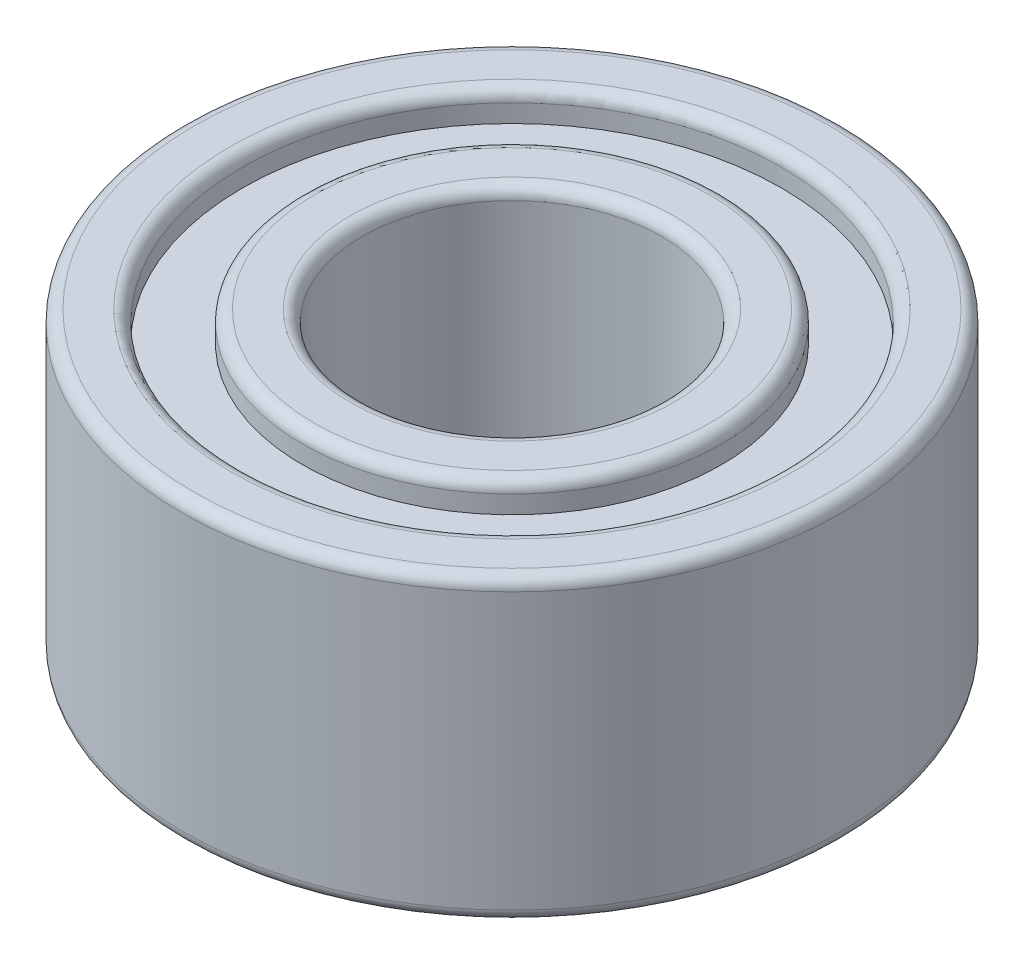
ISO-10303-21;
HEADER;
FILE_DESCRIPTION(('STEP AP214'),'2;1');
FILE_NAME('part.step','',(''),(''),'','','');
FILE_SCHEMA(('AUTOMOTIVE_DESIGN { 1 0 10303 214 1 1 1 1 }'));
ENDSEC;
DATA;
#1=APPLICATION_CONTEXT('core data for automotive mechanical design processes');
#2=APPLICATION_PROTOCOL_DEFINITION('international standard','automotive_design',2000,#1);
#3=PRODUCT_CONTEXT('',#1,'mechanical');
#4=PRODUCT('Part','Part','',(#3));
#5=PRODUCT_RELATED_PRODUCT_CATEGORY('part','',(#4));
#6=PRODUCT_DEFINITION_FORMATION('','',#4);
#7=PRODUCT_DEFINITION_CONTEXT('part definition',#1,'design');
#8=PRODUCT_DEFINITION('design','',#6,#7);
#9=PRODUCT_DEFINITION_SHAPE('','',#8);
#10=(LENGTH_UNIT() NAMED_UNIT(*) SI_UNIT(.MILLI.,.METRE.));
#11=(NAMED_UNIT(*) PLANE_ANGLE_UNIT() SI_UNIT($,.RADIAN.));
#12=(NAMED_UNIT(*) SI_UNIT($,.STERADIAN.) SOLID_ANGLE_UNIT());
#13=UNCERTAINTY_MEASURE_WITH_UNIT(LENGTH_MEASURE(1.E-05),#10,'distance_accuracy_value','');
#14=(GEOMETRIC_REPRESENTATION_CONTEXT(3) GLOBAL_UNCERTAINTY_ASSIGNED_CONTEXT((#13)) GLOBAL_UNIT_ASSIGNED_CONTEXT((#10,
#11,#12)) REPRESENTATION_CONTEXT('',''));
#15=CARTESIAN_POINT('',(0.,0.,0.));
#16=DIRECTION('',(0.,0.,1.));
#17=DIRECTION('',(1.,0.,0.));
#18=AXIS2_PLACEMENT_3D('',#15,#16,#17);
#19=CARTESIAN_POINT('',(0.,0.,0.));
#20=DIRECTION('',(0.,-1.,0.));
#21=DIRECTION('',(0.,0.,-1.));
#22=AXIS2_PLACEMENT_3D('',#19,#20,#21);
#23=CYLINDRICAL_SURFACE('',#22,2.5);
#24=CARTESIAN_POINT('',(0.,2.3,0.));
#25=DIRECTION('',(0.,1.,0.));
#26=DIRECTION('',(0.,0.,1.));
#27=AXIS2_PLACEMENT_3D('',#24,#25,#26);
#28=CIRCLE('',#27,2.5);
#29=CARTESIAN_POINT('',(0.,2.3,2.5));
#30=VERTEX_POINT('',#29);
#31=EDGE_CURVE('E266',#30,#30,#28,.F.);
#32=ORIENTED_EDGE('',*,*,#31,.F.);
#33=EDGE_LOOP('',(#32));
#34=FACE_BOUND('',#33,.T.);
#35=CARTESIAN_POINT('',(0.,-2.3,0.));
#36=DIRECTION('',(0.,-1.,0.));
#37=DIRECTION('',(0.,0.,-1.));
#38=AXIS2_PLACEMENT_3D('',#35,#36,#37);
#39=CIRCLE('',#38,2.5);
#40=CARTESIAN_POINT('',(0.,-2.3,-2.5));
#41=VERTEX_POINT('',#40);
#42=EDGE_CURVE('E92',#41,#41,#39,.F.);
#43=ORIENTED_EDGE('',*,*,#42,.F.);
#44=EDGE_LOOP('',(#43));
#45=FACE_BOUND('',#44,.T.);
#46=ADVANCED_FACE('F17',(#34,#45),#23,.F.);
#47=CARTESIAN_POINT('',(0.,2.3,0.));
#48=DIRECTION('',(0.,1.,0.));
#49=DIRECTION('',(0.,0.,1.));
#50=AXIS2_PLACEMENT_3D('',#47,#48,#49);
#51=TOROIDAL_SURFACE('',#50,2.7,0.2);
#52=ORIENTED_EDGE('',*,*,#31,.T.);
#53=EDGE_LOOP('',(#52));
#54=FACE_BOUND('',#53,.T.);
#55=CARTESIAN_POINT('',(0.,2.5,0.));
#56=DIRECTION('',(0.,1.,0.));
#57=DIRECTION('',(0.,0.,1.));
#58=AXIS2_PLACEMENT_3D('',#55,#56,#57);
#59=CIRCLE('',#58,2.7);
#60=CARTESIAN_POINT('',(0.,2.5,-2.7));
#61=VERTEX_POINT('',#60);
#62=CARTESIAN_POINT('',(0.,2.5,2.7));
#63=VERTEX_POINT('',#62);
#64=EDGE_CURVE('E82',#61,#63,#59,.F.);
#65=ORIENTED_EDGE('',*,*,#64,.F.);
#66=CARTESIAN_POINT('',(0.,2.5,0.));
#67=DIRECTION('',(0.,1.,0.));
#68=DIRECTION('',(0.,0.,-1.));
#69=AXIS2_PLACEMENT_3D('',#66,#67,#68);
#70=CIRCLE('',#69,2.7);
#71=EDGE_CURVE('E80',#63,#61,#70,.F.);
#72=ORIENTED_EDGE('',*,*,#71,.F.);
#73=EDGE_LOOP('',(#65,#72));
#74=FACE_BOUND('',#73,.T.);
#75=ADVANCED_FACE('F84',(#54,#74),#51,.T.);
#76=CARTESIAN_POINT('',(0.,-2.3,0.));
#77=DIRECTION('',(0.,-1.,0.));
#78=DIRECTION('',(0.,0.,-1.));
#79=AXIS2_PLACEMENT_3D('',#76,#77,#78);
#80=TOROIDAL_SURFACE('',#79,2.7,0.2);
#81=ORIENTED_EDGE('',*,*,#42,.T.);
#82=EDGE_LOOP('',(#81));
#83=FACE_BOUND('',#82,.T.);
#84=CARTESIAN_POINT('',(0.,-2.5,0.));
#85=DIRECTION('',(0.,-1.,0.));
#86=DIRECTION('',(0.,0.,-1.));
#87=AXIS2_PLACEMENT_3D('',#84,#85,#86);
#88=CIRCLE('',#87,2.7);
#89=CARTESIAN_POINT('',(0.,-2.5,2.7));
#90=VERTEX_POINT('',#89);
#91=CARTESIAN_POINT('',(0.,-2.5,-2.7));
#92=VERTEX_POINT('',#91);
#93=EDGE_CURVE('E185',#90,#92,#88,.F.);
#94=ORIENTED_EDGE('',*,*,#93,.F.);
#95=CARTESIAN_POINT('',(0.,-2.5,0.));
#96=DIRECTION('',(0.,-1.,0.));
#97=DIRECTION('',(0.,0.,1.));
#98=AXIS2_PLACEMENT_3D('',#95,#96,#97);
#99=CIRCLE('',#98,2.7);
#100=EDGE_CURVE('E87',#92,#90,#99,.F.);
#101=ORIENTED_EDGE('',*,*,#100,.F.);
#102=EDGE_LOOP('',(#94,#101));
#103=FACE_BOUND('',#102,.T.);
#104=ADVANCED_FACE('F113',(#83,#103),#80,.T.);
#105=CARTESIAN_POINT('',(3.5,2.5,0.));
#106=DIRECTION('',(0.,1.,0.));
#107=DIRECTION('',(0.,0.,1.));
#108=AXIS2_PLACEMENT_3D('',#105,#106,#107);
#109=PLANE('',#108);
#110=CARTESIAN_POINT('',(0.,2.5,0.));
#111=DIRECTION('',(0.,-1.,0.));
#112=DIRECTION('',(0.,0.,-1.));
#113=AXIS2_PLACEMENT_3D('',#110,#111,#112);
#114=CIRCLE('',#113,3.3);
#115=CARTESIAN_POINT('',(0.,2.5,-3.3));
#116=VERTEX_POINT('',#115);
#117=CARTESIAN_POINT('',(0.,2.5,3.3));
#118=VERTEX_POINT('',#117);
#119=EDGE_CURVE('E220',#116,#118,#114,.T.);
#120=ORIENTED_EDGE('',*,*,#119,.F.);
#121=CARTESIAN_POINT('',(0.,2.5,0.));
#122=DIRECTION('',(0.,-1.,0.));
#123=DIRECTION('',(0.,0.,1.));
#124=AXIS2_PLACEMENT_3D('',#121,#122,#123);
#125=CIRCLE('',#124,3.3);
#126=EDGE_CURVE('E137',#118,#116,#125,.T.);
#127=ORIENTED_EDGE('',*,*,#126,.F.);
#128=EDGE_LOOP('',(#120,#127));
#129=FACE_BOUND('',#128,.T.);
#130=ORIENTED_EDGE('',*,*,#71,.T.);
#131=ORIENTED_EDGE('',*,*,#64,.T.);
#132=EDGE_LOOP('',(#130,#131));
#133=FACE_BOUND('',#132,.T.);
#134=ADVANCED_FACE('F91',(#129,#133),#109,.T.);
#135=CARTESIAN_POINT('',(2.5,-2.5,0.));
#136=DIRECTION('',(0.,-1.,0.));
#137=DIRECTION('',(0.,0.,-1.));
#138=AXIS2_PLACEMENT_3D('',#135,#136,#137);
#139=PLANE('',#138);
#140=CARTESIAN_POINT('',(0.,-2.5,0.));
#141=DIRECTION('',(0.,1.,0.));
#142=DIRECTION('',(0.,0.,1.));
#143=AXIS2_PLACEMENT_3D('',#140,#141,#142);
#144=CIRCLE('',#143,3.3);
#145=CARTESIAN_POINT('',(0.,-2.5,3.3));
#146=VERTEX_POINT('',#145);
#147=CARTESIAN_POINT('',(0.,-2.5,-3.3));
#148=VERTEX_POINT('',#147);
#149=EDGE_CURVE('E197',#146,#148,#144,.T.);
#150=ORIENTED_EDGE('',*,*,#149,.F.);
#151=CARTESIAN_POINT('',(0.,-2.5,0.));
#152=DIRECTION('',(0.,1.,0.));
#153=DIRECTION('',(0.,0.,-1.));
#154=AXIS2_PLACEMENT_3D('',#151,#152,#153);
#155=CIRCLE('',#154,3.3);
#156=EDGE_CURVE('E208',#148,#146,#155,.T.);
#157=ORIENTED_EDGE('',*,*,#156,.F.);
#158=EDGE_LOOP('',(#150,#157));
#159=FACE_BOUND('',#158,.T.);
#160=ORIENTED_EDGE('',*,*,#100,.T.);
#161=ORIENTED_EDGE('',*,*,#93,.T.);
#162=EDGE_LOOP('',(#160,#161));
#163=FACE_BOUND('',#162,.T.);
#164=ADVANCED_FACE('F112',(#159,#163),#139,.T.);
#165=CARTESIAN_POINT('',(0.,2.3,0.));
#166=DIRECTION('',(0.,1.,0.));
#167=DIRECTION('',(0.,0.,1.));
#168=AXIS2_PLACEMENT_3D('',#165,#166,#167);
#169=TOROIDAL_SURFACE('',#168,3.3,0.2);
#170=CARTESIAN_POINT('',(0.,2.3,0.));
#171=DIRECTION('',(0.,-1.,0.));
#172=DIRECTION('',(0.,0.,-1.));
#173=AXIS2_PLACEMENT_3D('',#170,#171,#172);
#174=CIRCLE('',#173,3.5);
#175=CARTESIAN_POINT('',(0.,2.3,-3.5));
#176=VERTEX_POINT('',#175);
#177=EDGE_CURVE('E170',#176,#176,#174,.T.);
#178=ORIENTED_EDGE('',*,*,#177,.F.);
#179=EDGE_LOOP('',(#178));
#180=FACE_BOUND('',#179,.T.);
#181=ORIENTED_EDGE('',*,*,#126,.T.);
#182=ORIENTED_EDGE('',*,*,#119,.T.);
#183=EDGE_LOOP('',(#181,#182));
#184=FACE_BOUND('',#183,.T.);
#185=ADVANCED_FACE('F152',(#180,#184),#169,.T.);
#186=CARTESIAN_POINT('',(0.,-2.3,0.));
#187=DIRECTION('',(0.,-1.,0.));
#188=DIRECTION('',(0.,0.,-1.));
#189=AXIS2_PLACEMENT_3D('',#186,#187,#188);
#190=TOROIDAL_SURFACE('',#189,3.3,0.2);
#191=CARTESIAN_POINT('',(0.,-2.3,0.));
#192=DIRECTION('',(0.,-1.,0.));
#193=DIRECTION('',(0.,0.,-1.));
#194=AXIS2_PLACEMENT_3D('',#191,#192,#193);
#195=CIRCLE('',#194,3.5);
#196=CARTESIAN_POINT('',(0.,-2.3,-3.5));
#197=VERTEX_POINT('',#196);
#198=EDGE_CURVE('E219',#197,#197,#195,.F.);
#199=ORIENTED_EDGE('',*,*,#198,.F.);
#200=EDGE_LOOP('',(#199));
#201=FACE_BOUND('',#200,.T.);
#202=ORIENTED_EDGE('',*,*,#156,.T.);
#203=ORIENTED_EDGE('',*,*,#149,.T.);
#204=EDGE_LOOP('',(#202,#203));
#205=FACE_BOUND('',#204,.T.);
#206=ADVANCED_FACE('F161',(#201,#205),#190,.T.);
#207=CARTESIAN_POINT('',(0.,0.,0.));
#208=DIRECTION('',(0.,-1.,0.));
#209=DIRECTION('',(0.,0.,-1.));
#210=AXIS2_PLACEMENT_3D('',#207,#208,#209);
#211=CYLINDRICAL_SURFACE('',#210,3.5);
#212=ORIENTED_EDGE('',*,*,#177,.T.);
#213=EDGE_LOOP('',(#212));
#214=FACE_BOUND('',#213,.T.);
#215=CARTESIAN_POINT('',(0.,2.,0.));
#216=DIRECTION('',(0.,-1.,0.));
#217=DIRECTION('',(0.,0.,-1.));
#218=AXIS2_PLACEMENT_3D('',#215,#216,#217);
#219=CIRCLE('',#218,3.5);
#220=CARTESIAN_POINT('',(0.,2.,-3.5));
#221=VERTEX_POINT('',#220);
#222=EDGE_CURVE('E279',#221,#221,#219,.T.);
#223=ORIENTED_EDGE('',*,*,#222,.F.);
#224=EDGE_LOOP('',(#223));
#225=FACE_BOUND('',#224,.T.);
#226=ADVANCED_FACE('F472',(#214,#225),#211,.T.);
#227=CARTESIAN_POINT('',(0.,0.,0.));
#228=DIRECTION('',(0.,-1.,0.));
#229=DIRECTION('',(0.,0.,-1.));
#230=AXIS2_PLACEMENT_3D('',#227,#228,#229);
#231=CYLINDRICAL_SURFACE('',#230,3.5);
#232=CARTESIAN_POINT('',(0.,-2.,0.));
#233=DIRECTION('',(0.,-1.,0.));
#234=DIRECTION('',(0.,0.,-1.));
#235=AXIS2_PLACEMENT_3D('',#232,#233,#234);
#236=CIRCLE('',#235,3.5);
#237=CARTESIAN_POINT('',(0.,-2.,-3.5));
#238=VERTEX_POINT('',#237);
#239=EDGE_CURVE('E276',#238,#238,#236,.F.);
#240=ORIENTED_EDGE('',*,*,#239,.F.);
#241=EDGE_LOOP('',(#240));
#242=FACE_BOUND('',#241,.T.);
#243=ORIENTED_EDGE('',*,*,#198,.T.);
#244=EDGE_LOOP('',(#243));
#245=FACE_BOUND('',#244,.T.);
#246=ADVANCED_FACE('F469',(#242,#245),#231,.T.);
#247=CARTESIAN_POINT('',(4.5,2.,0.));
#248=DIRECTION('',(0.,1.,0.));
#249=DIRECTION('',(0.,0.,1.));
#250=AXIS2_PLACEMENT_3D('',#247,#248,#249);
#251=PLANE('',#250);
#252=CARTESIAN_POINT('',(0.,2.,0.));
#253=DIRECTION('',(0.,-1.,0.));
#254=DIRECTION('',(0.,0.,-1.));
#255=AXIS2_PLACEMENT_3D('',#252,#253,#254);
#256=CIRCLE('',#255,4.5);
#257=CARTESIAN_POINT('',(0.,2.,-4.5));
#258=VERTEX_POINT('',#257);
#259=EDGE_CURVE('E273',#258,#258,#256,.F.);
#260=ORIENTED_EDGE('',*,*,#259,.T.);
#261=EDGE_LOOP('',(#260));
#262=FACE_BOUND('',#261,.T.);
#263=ORIENTED_EDGE('',*,*,#222,.T.);
#264=EDGE_LOOP('',(#263));
#265=FACE_BOUND('',#264,.T.);
#266=ADVANCED_FACE('F560',(#262,#265),#251,.T.);
#267=CARTESIAN_POINT('',(3.5,-2.,0.));
#268=DIRECTION('',(0.,-1.,0.));
#269=DIRECTION('',(0.,0.,-1.));
#270=AXIS2_PLACEMENT_3D('',#267,#268,#269);
#271=PLANE('',#270);
#272=ORIENTED_EDGE('',*,*,#239,.T.);
#273=EDGE_LOOP('',(#272));
#274=FACE_BOUND('',#273,.T.);
#275=CARTESIAN_POINT('',(0.,-2.,0.));
#276=DIRECTION('',(0.,-1.,0.));
#277=DIRECTION('',(0.,0.,-1.));
#278=AXIS2_PLACEMENT_3D('',#275,#276,#277);
#279=CIRCLE('',#278,4.5);
#280=CARTESIAN_POINT('',(0.,-2.,-4.5));
#281=VERTEX_POINT('',#280);
#282=EDGE_CURVE('E269',#281,#281,#279,.T.);
#283=ORIENTED_EDGE('',*,*,#282,.T.);
#284=EDGE_LOOP('',(#283));
#285=FACE_BOUND('',#284,.T.);
#286=ADVANCED_FACE('F551',(#274,#285),#271,.T.);
#287=CARTESIAN_POINT('',(0.,0.,0.));
#288=DIRECTION('',(0.,-1.,0.));
#289=DIRECTION('',(0.,0.,-1.));
#290=AXIS2_PLACEMENT_3D('',#287,#288,#289);
#291=CYLINDRICAL_SURFACE('',#290,4.5);
#292=CARTESIAN_POINT('',(0.,2.3,0.));
#293=DIRECTION('',(0.,1.,0.));
#294=DIRECTION('',(0.,0.,1.));
#295=AXIS2_PLACEMENT_3D('',#292,#293,#294);
#296=CIRCLE('',#295,4.5);
#297=CARTESIAN_POINT('',(0.,2.3,4.5));
#298=VERTEX_POINT('',#297);
#299=EDGE_CURVE('E272',#298,#298,#296,.F.);
#300=ORIENTED_EDGE('',*,*,#299,.F.);
#301=EDGE_LOOP('',(#300));
#302=FACE_BOUND('',#301,.T.);
#303=ORIENTED_EDGE('',*,*,#259,.F.);
#304=EDGE_LOOP('',(#303));
#305=FACE_BOUND('',#304,.T.);
#306=ADVANCED_FACE('F543',(#302,#305),#291,.F.);
#307=CARTESIAN_POINT('',(0.,0.,0.));
#308=DIRECTION('',(0.,-1.,0.));
#309=DIRECTION('',(0.,0.,-1.));
#310=AXIS2_PLACEMENT_3D('',#307,#308,#309);
#311=CYLINDRICAL_SURFACE('',#310,4.5);
#312=ORIENTED_EDGE('',*,*,#282,.F.);
#313=EDGE_LOOP('',(#312));
#314=FACE_BOUND('',#313,.T.);
#315=CARTESIAN_POINT('',(0.,-2.3,0.));
#316=DIRECTION('',(0.,-1.,0.));
#317=DIRECTION('',(0.,0.,-1.));
#318=AXIS2_PLACEMENT_3D('',#315,#316,#317);
#319=CIRCLE('',#318,4.5);
#320=CARTESIAN_POINT('',(0.,-2.3,-4.5));
#321=VERTEX_POINT('',#320);
#322=EDGE_CURVE('E456',#321,#321,#319,.F.);
#323=ORIENTED_EDGE('',*,*,#322,.F.);
#324=EDGE_LOOP('',(#323));
#325=FACE_BOUND('',#324,.T.);
#326=ADVANCED_FACE('F535',(#314,#325),#311,.F.);
#327=CARTESIAN_POINT('',(0.,2.3,0.));
#328=DIRECTION('',(0.,1.,0.));
#329=DIRECTION('',(0.,0.,1.));
#330=AXIS2_PLACEMENT_3D('',#327,#328,#329);
#331=TOROIDAL_SURFACE('',#330,4.7,0.2);
#332=ORIENTED_EDGE('',*,*,#299,.T.);
#333=EDGE_LOOP('',(#332));
#334=FACE_BOUND('',#333,.T.);
#335=CARTESIAN_POINT('',(0.,2.5,0.));
#336=DIRECTION('',(0.,1.,0.));
#337=DIRECTION('',(0.,0.,1.));
#338=AXIS2_PLACEMENT_3D('',#335,#336,#337);
#339=CIRCLE('',#338,4.7);
#340=CARTESIAN_POINT('',(0.,2.5,-4.7));
#341=VERTEX_POINT('',#340);
#342=CARTESIAN_POINT('',(0.,2.5,4.7));
#343=VERTEX_POINT('',#342);
#344=EDGE_CURVE('E377',#341,#343,#339,.F.);
#345=ORIENTED_EDGE('',*,*,#344,.F.);
#346=CARTESIAN_POINT('',(0.,2.5,0.));
#347=DIRECTION('',(0.,1.,0.));
#348=DIRECTION('',(0.,0.,-1.));
#349=AXIS2_PLACEMENT_3D('',#346,#347,#348);
#350=CIRCLE('',#349,4.7);
#351=EDGE_CURVE('E367',#343,#341,#350,.F.);
#352=ORIENTED_EDGE('',*,*,#351,.F.);
#353=EDGE_LOOP('',(#345,#352));
#354=FACE_BOUND('',#353,.T.);
#355=ADVANCED_FACE('F428',(#334,#354),#331,.T.);
#356=CARTESIAN_POINT('',(0.,-2.3,0.));
#357=DIRECTION('',(0.,-1.,0.));
#358=DIRECTION('',(0.,0.,-1.));
#359=AXIS2_PLACEMENT_3D('',#356,#357,#358);
#360=TOROIDAL_SURFACE('',#359,4.7,0.2);
#361=ORIENTED_EDGE('',*,*,#322,.T.);
#362=EDGE_LOOP('',(#361));
#363=FACE_BOUND('',#362,.T.);
#364=CARTESIAN_POINT('',(0.,-2.5,0.));
#365=DIRECTION('',(0.,-1.,0.));
#366=DIRECTION('',(0.,0.,-1.));
#367=AXIS2_PLACEMENT_3D('',#364,#365,#366);
#368=CIRCLE('',#367,4.7);
#369=CARTESIAN_POINT('',(0.,-2.5,4.7));
#370=VERTEX_POINT('',#369);
#371=CARTESIAN_POINT('',(0.,-2.5,-4.7));
#372=VERTEX_POINT('',#371);
#373=EDGE_CURVE('E489',#370,#372,#368,.F.);
#374=ORIENTED_EDGE('',*,*,#373,.F.);
#375=CARTESIAN_POINT('',(0.,-2.5,0.));
#376=DIRECTION('',(0.,-1.,0.));
#377=DIRECTION('',(0.,0.,1.));
#378=AXIS2_PLACEMENT_3D('',#375,#376,#377);
#379=CIRCLE('',#378,4.7);
#380=EDGE_CURVE('E314',#372,#370,#379,.F.);
#381=ORIENTED_EDGE('',*,*,#380,.F.);
#382=EDGE_LOOP('',(#374,#381));
#383=FACE_BOUND('',#382,.T.);
#384=ADVANCED_FACE('F424',(#363,#383),#360,.T.);
#385=CARTESIAN_POINT('',(5.5,2.5,0.));
#386=DIRECTION('',(0.,1.,0.));
#387=DIRECTION('',(0.,0.,1.));
#388=AXIS2_PLACEMENT_3D('',#385,#386,#387);
#389=PLANE('',#388);
#390=CARTESIAN_POINT('',(0.,2.5,0.));
#391=DIRECTION('',(0.,-1.,0.));
#392=DIRECTION('',(0.,0.,-1.));
#393=AXIS2_PLACEMENT_3D('',#390,#391,#392);
#394=CIRCLE('',#393,5.3);
#395=CARTESIAN_POINT('',(0.,2.5,-5.3));
#396=VERTEX_POINT('',#395);
#397=CARTESIAN_POINT('',(0.,2.5,5.3));
#398=VERTEX_POINT('',#397);
#399=EDGE_CURVE('E390',#396,#398,#394,.T.);
#400=ORIENTED_EDGE('',*,*,#399,.F.);
#401=CARTESIAN_POINT('',(0.,2.5,0.));
#402=DIRECTION('',(0.,-1.,0.));
#403=DIRECTION('',(0.,0.,1.));
#404=AXIS2_PLACEMENT_3D('',#401,#402,#403);
#405=CIRCLE('',#404,5.3);
#406=EDGE_CURVE('E400',#398,#396,#405,.T.);
#407=ORIENTED_EDGE('',*,*,#406,.F.);
#408=EDGE_LOOP('',(#400,#407));
#409=FACE_BOUND('',#408,.T.);
#410=ORIENTED_EDGE('',*,*,#351,.T.);
#411=ORIENTED_EDGE('',*,*,#344,.T.);
#412=EDGE_LOOP('',(#410,#411));
#413=FACE_BOUND('',#412,.T.);
#414=ADVANCED_FACE('F328',(#409,#413),#389,.T.);
#415=CARTESIAN_POINT('',(4.5,-2.5,0.));
#416=DIRECTION('',(0.,-1.,0.));
#417=DIRECTION('',(0.,0.,-1.));
#418=AXIS2_PLACEMENT_3D('',#415,#416,#417);
#419=PLANE('',#418);
#420=CARTESIAN_POINT('',(0.,-2.5,0.));
#421=DIRECTION('',(0.,1.,0.));
#422=DIRECTION('',(0.,0.,1.));
#423=AXIS2_PLACEMENT_3D('',#420,#421,#422);
#424=CIRCLE('',#423,5.3);
#425=CARTESIAN_POINT('',(0.,-2.5,5.3));
#426=VERTEX_POINT('',#425);
#427=CARTESIAN_POINT('',(0.,-2.5,-5.3));
#428=VERTEX_POINT('',#427);
#429=EDGE_CURVE('E354',#426,#428,#424,.T.);
#430=ORIENTED_EDGE('',*,*,#429,.F.);
#431=CARTESIAN_POINT('',(0.,-2.5,0.));
#432=DIRECTION('',(0.,1.,0.));
#433=DIRECTION('',(0.,0.,-1.));
#434=AXIS2_PLACEMENT_3D('',#431,#432,#433);
#435=CIRCLE('',#434,5.3);
#436=EDGE_CURVE('E35',#428,#426,#435,.T.);
#437=ORIENTED_EDGE('',*,*,#436,.F.);
#438=EDGE_LOOP('',(#430,#437));
#439=FACE_BOUND('',#438,.T.);
#440=ORIENTED_EDGE('',*,*,#380,.T.);
#441=ORIENTED_EDGE('',*,*,#373,.T.);
#442=EDGE_LOOP('',(#440,#441));
#443=FACE_BOUND('',#442,.T.);
#444=ADVANCED_FACE('F319',(#439,#443),#419,.T.);
#445=CARTESIAN_POINT('',(0.,2.3,0.));
#446=DIRECTION('',(0.,1.,0.));
#447=DIRECTION('',(0.,0.,1.));
#448=AXIS2_PLACEMENT_3D('',#445,#446,#447);
#449=TOROIDAL_SURFACE('',#448,5.3,0.2);
#450=ORIENTED_EDGE('',*,*,#406,.T.);
#451=ORIENTED_EDGE('',*,*,#399,.T.);
#452=EDGE_LOOP('',(#450,#451));
#453=FACE_BOUND('',#452,.T.);
#454=CARTESIAN_POINT('',(0.,2.3,0.));
#455=DIRECTION('',(0.,-1.,0.));
#456=DIRECTION('',(0.,0.,-1.));
#457=AXIS2_PLACEMENT_3D('',#454,#455,#456);
#458=CIRCLE('',#457,5.5);
#459=CARTESIAN_POINT('',(0.,2.3,-5.5));
#460=VERTEX_POINT('',#459);
#461=EDGE_CURVE('E27',#460,#460,#458,.T.);
#462=ORIENTED_EDGE('',*,*,#461,.F.);
#463=EDGE_LOOP('',(#462));
#464=FACE_BOUND('',#463,.T.);
#465=ADVANCED_FACE('F301',(#453,#464),#449,.T.);
#466=CARTESIAN_POINT('',(0.,-2.3,0.));
#467=DIRECTION('',(0.,-1.,0.));
#468=DIRECTION('',(0.,0.,-1.));
#469=AXIS2_PLACEMENT_3D('',#466,#467,#468);
#470=TOROIDAL_SURFACE('',#469,5.3,0.2);
#471=ORIENTED_EDGE('',*,*,#436,.T.);
#472=ORIENTED_EDGE('',*,*,#429,.T.);
#473=EDGE_LOOP('',(#471,#472));
#474=FACE_BOUND('',#473,.T.);
#475=CARTESIAN_POINT('',(0.,-2.3,0.));
#476=DIRECTION('',(0.,-1.,0.));
#477=DIRECTION('',(0.,0.,-1.));
#478=AXIS2_PLACEMENT_3D('',#475,#476,#477);
#479=CIRCLE('',#478,5.5);
#480=CARTESIAN_POINT('',(0.,-2.3,-5.5));
#481=VERTEX_POINT('',#480);
#482=EDGE_CURVE('E11',#481,#481,#479,.F.);
#483=ORIENTED_EDGE('',*,*,#482,.F.);
#484=EDGE_LOOP('',(#483));
#485=FACE_BOUND('',#484,.T.);
#486=ADVANCED_FACE('F289',(#474,#485),#470,.T.);
#487=CARTESIAN_POINT('',(0.,0.,0.));
#488=DIRECTION('',(0.,-1.,0.));
#489=DIRECTION('',(0.,0.,-1.));
#490=AXIS2_PLACEMENT_3D('',#487,#488,#489);
#491=CYLINDRICAL_SURFACE('',#490,5.5);
#492=ORIENTED_EDGE('',*,*,#482,.T.);
#493=EDGE_LOOP('',(#492));
#494=FACE_BOUND('',#493,.T.);
#495=ORIENTED_EDGE('',*,*,#461,.T.);
#496=EDGE_LOOP('',(#495));
#497=FACE_BOUND('',#496,.T.);
#498=ADVANCED_FACE('F300',(#494,#497),#491,.T.);
#499=CLOSED_SHELL('',(#46,#75,#104,#134,#164,#185,#206,#226,#246,#266,#286,#306,#326,#355,#384,
#414,#444,#465,#486,#498));
#500=MANIFOLD_SOLID_BREP('B1',#499);
#501=ADVANCED_BREP_SHAPE_REPRESENTATION('',(#18,#500),#14);
#502=SHAPE_DEFINITION_REPRESENTATION(#9,#501);
ENDSEC;
END-ISO-10303-21;
